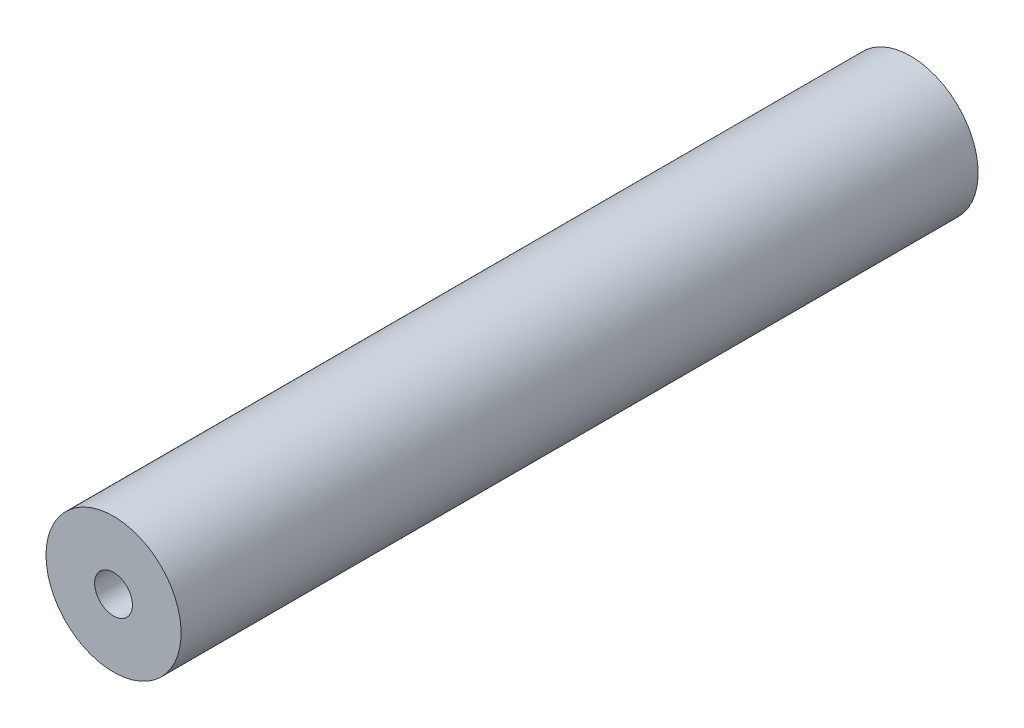
ISO-10303-21;
HEADER;
FILE_DESCRIPTION(('STEP AP214'),'2;1');
FILE_NAME('part.step','',(''),(''),'','','');
FILE_SCHEMA(('AUTOMOTIVE_DESIGN { 1 0 10303 214 1 1 1 1 }'));
ENDSEC;
DATA;
#1=APPLICATION_CONTEXT('core data for automotive mechanical design processes');
#2=APPLICATION_PROTOCOL_DEFINITION('international standard','automotive_design',2000,#1);
#3=PRODUCT_CONTEXT('',#1,'mechanical');
#4=PRODUCT('Part','Part','',(#3));
#5=PRODUCT_RELATED_PRODUCT_CATEGORY('part','',(#4));
#6=PRODUCT_DEFINITION_FORMATION('','',#4);
#7=PRODUCT_DEFINITION_CONTEXT('part definition',#1,'design');
#8=PRODUCT_DEFINITION('design','',#6,#7);
#9=PRODUCT_DEFINITION_SHAPE('','',#8);
#10=(LENGTH_UNIT() NAMED_UNIT(*) SI_UNIT(.MILLI.,.METRE.));
#11=(NAMED_UNIT(*) PLANE_ANGLE_UNIT() SI_UNIT($,.RADIAN.));
#12=(NAMED_UNIT(*) SI_UNIT($,.STERADIAN.) SOLID_ANGLE_UNIT());
#13=UNCERTAINTY_MEASURE_WITH_UNIT(LENGTH_MEASURE(1.E-05),#10,'distance_accuracy_value','');
#14=(GEOMETRIC_REPRESENTATION_CONTEXT(3) GLOBAL_UNCERTAINTY_ASSIGNED_CONTEXT((#13)) GLOBAL_UNIT_ASSIGNED_CONTEXT((#10,
#11,#12)) REPRESENTATION_CONTEXT('',''));
#15=CARTESIAN_POINT('',(0.,0.,0.));
#16=DIRECTION('',(0.,0.,1.));
#17=DIRECTION('',(1.,0.,0.));
#18=AXIS2_PLACEMENT_3D('',#15,#16,#17);
#19=CARTESIAN_POINT('',(0.,0.,374.65));
#20=DIRECTION('',(0.,0.,-1.));
#21=DIRECTION('',(-1.,0.,0.));
#22=AXIS2_PLACEMENT_3D('',#19,#20,#21);
#23=CYLINDRICAL_SURFACE('',#22,31.75);
#24=CARTESIAN_POINT('',(0.,0.,374.65));
#25=DIRECTION('',(0.,0.,1.));
#26=DIRECTION('',(1.,0.,0.));
#27=AXIS2_PLACEMENT_3D('',#24,#25,#26);
#28=CIRCLE('',#27,31.75);
#29=CARTESIAN_POINT('',(-31.75,0.,374.65));
#30=VERTEX_POINT('',#29);
#31=EDGE_CURVE('E10',#30,#30,#28,.T.);
#32=CARTESIAN_POINT('',(0.,0.,0.));
#33=DIRECTION('',(0.,0.,1.));
#34=DIRECTION('',(1.,0.,0.));
#35=AXIS2_PLACEMENT_3D('',#32,#33,#34);
#36=CIRCLE('',#35,31.75);
#37=CARTESIAN_POINT('',(-31.75,0.,0.));
#38=VERTEX_POINT('',#37);
#39=EDGE_CURVE('E38',#38,#38,#36,.T.);
#40=CARTESIAN_POINT('',(-31.75,0.,374.65));
#41=CARTESIAN_POINT('',(-31.75,0.,370.747395833333));
#42=CARTESIAN_POINT('',(-31.75,0.,366.844791666667));
#43=CARTESIAN_POINT('',(-31.75,0.,359.039583333333));
#44=CARTESIAN_POINT('',(-31.75,0.,355.136979166667));
#45=CARTESIAN_POINT('',(-31.75,0.,347.331770833333));
#46=CARTESIAN_POINT('',(-31.75,0.,343.429166666667));
#47=CARTESIAN_POINT('',(-31.75,0.,335.623958333333));
#48=CARTESIAN_POINT('',(-31.75,0.,331.721354166667));
#49=CARTESIAN_POINT('',(-31.75,0.,323.916145833333));
#50=CARTESIAN_POINT('',(-31.75,0.,320.013541666667));
#51=CARTESIAN_POINT('',(-31.75,0.,312.208333333333));
#52=CARTESIAN_POINT('',(-31.75,0.,308.305729166667));
#53=CARTESIAN_POINT('',(-31.75,0.,300.500520833333));
#54=CARTESIAN_POINT('',(-31.75,0.,296.597916666667));
#55=CARTESIAN_POINT('',(-31.75,0.,288.792708333333));
#56=CARTESIAN_POINT('',(-31.75,0.,284.890104166667));
#57=CARTESIAN_POINT('',(-31.75,0.,277.084895833333));
#58=CARTESIAN_POINT('',(-31.75,0.,273.182291666667));
#59=CARTESIAN_POINT('',(-31.75,0.,265.377083333333));
#60=CARTESIAN_POINT('',(-31.75,0.,261.474479166667));
#61=CARTESIAN_POINT('',(-31.75,0.,253.669270833333));
#62=CARTESIAN_POINT('',(-31.75,0.,249.766666666667));
#63=CARTESIAN_POINT('',(-31.75,0.,241.961458333333));
#64=CARTESIAN_POINT('',(-31.75,0.,238.058854166667));
#65=CARTESIAN_POINT('',(-31.75,0.,230.253645833333));
#66=CARTESIAN_POINT('',(-31.75,0.,226.351041666667));
#67=CARTESIAN_POINT('',(-31.75,0.,218.545833333333));
#68=CARTESIAN_POINT('',(-31.75,0.,214.643229166667));
#69=CARTESIAN_POINT('',(-31.75,0.,206.838020833333));
#70=CARTESIAN_POINT('',(-31.75,0.,202.935416666667));
#71=CARTESIAN_POINT('',(-31.75,0.,195.130208333333));
#72=CARTESIAN_POINT('',(-31.75,0.,191.227604166667));
#73=CARTESIAN_POINT('',(-31.75,0.,183.422395833333));
#74=CARTESIAN_POINT('',(-31.75,0.,179.519791666667));
#75=CARTESIAN_POINT('',(-31.75,0.,171.714583333333));
#76=CARTESIAN_POINT('',(-31.75,0.,167.811979166667));
#77=CARTESIAN_POINT('',(-31.75,0.,160.006770833333));
#78=CARTESIAN_POINT('',(-31.75,0.,156.104166666667));
#79=CARTESIAN_POINT('',(-31.75,0.,148.298958333333));
#80=CARTESIAN_POINT('',(-31.75,0.,144.396354166667));
#81=CARTESIAN_POINT('',(-31.75,0.,136.591145833333));
#82=CARTESIAN_POINT('',(-31.75,0.,132.688541666667));
#83=CARTESIAN_POINT('',(-31.75,0.,124.883333333333));
#84=CARTESIAN_POINT('',(-31.75,0.,120.980729166667));
#85=CARTESIAN_POINT('',(-31.75,0.,113.175520833333));
#86=CARTESIAN_POINT('',(-31.75,0.,109.272916666667));
#87=CARTESIAN_POINT('',(-31.75,0.,101.467708333333));
#88=CARTESIAN_POINT('',(-31.75,0.,97.5651041666667));
#89=CARTESIAN_POINT('',(-31.75,0.,89.7598958333333));
#90=CARTESIAN_POINT('',(-31.75,0.,85.8572916666667));
#91=CARTESIAN_POINT('',(-31.75,0.,78.0520833333333));
#92=CARTESIAN_POINT('',(-31.75,0.,74.1494791666667));
#93=CARTESIAN_POINT('',(-31.75,0.,66.3442708333333));
#94=CARTESIAN_POINT('',(-31.75,0.,62.4416666666667));
#95=CARTESIAN_POINT('',(-31.75,0.,54.6364583333333));
#96=CARTESIAN_POINT('',(-31.75,0.,50.7338541666667));
#97=CARTESIAN_POINT('',(-31.75,0.,42.9286458333333));
#98=CARTESIAN_POINT('',(-31.75,0.,39.0260416666667));
#99=CARTESIAN_POINT('',(-31.75,0.,31.2208333333333));
#100=CARTESIAN_POINT('',(-31.75,0.,27.3182291666667));
#101=CARTESIAN_POINT('',(-31.75,0.,19.5130208333333));
#102=CARTESIAN_POINT('',(-31.75,0.,15.6104166666667));
#103=CARTESIAN_POINT('',(-31.75,0.,7.80520833333335));
#104=CARTESIAN_POINT('',(-31.75,0.,3.90260416666668));
#105=CARTESIAN_POINT('',(-31.75,0.,0.));
#106=B_SPLINE_CURVE_WITH_KNOTS('',3,(#40,#41,#42,#43,#44,#45,#46,#47,#48,#49,#50,#51,#52,#53,
#54,#55,#56,#57,#58,#59,#60,#61,#62,#63,#64,#65,#66,#67,#68,#69,#70,#71,#72,#73,#74,#75,#76,#77,
#78,#79,#80,#81,#82,#83,#84,#85,#86,#87,#88,#89,#90,#91,#92,#93,#94,#95,#96,#97,#98,#99,#100,
#101,#102,#103,#104,#105),.UNSPECIFIED.,.F.,.F.,(4,2,2,2,2,2,2,2,2,2,2,2,2,2,2,2,2,2,2,2,2,2,2,
2,2,2,2,2,2,2,2,2,4),(0.,11.7078125,23.4156250000001,35.1234375,46.83125,58.5390625,70.246875,
81.9546875,93.6625,105.3703125,117.078125,128.7859375,140.49375,152.2015625,163.909375,
175.6171875,187.325,199.0328125,210.740625,222.4484375,234.15625,245.8640625,257.571875,
269.2796875,280.9875,292.6953125,304.403125,316.1109375,327.81875,339.5265625,351.234375,
362.9421875,374.65),.UNSPECIFIED.);
#107=EDGE_CURVE('BSEAM35',#30,#38,#106,.T.);
#108=ORIENTED_EDGE('',*,*,#31,.F.);
#109=ORIENTED_EDGE('',*,*,#39,.T.);
#110=ORIENTED_EDGE('',*,*,#107,.T.);
#111=ORIENTED_EDGE('',*,*,#107,.F.);
#112=EDGE_LOOP('',(#108,#110,#109,#111));
#113=FACE_BOUND('',#112,.T.);
#114=ADVANCED_FACE('F35',(#113),#23,.T.);
#115=CARTESIAN_POINT('',(0.,0.,374.65));
#116=DIRECTION('',(0.,0.,1.));
#117=DIRECTION('',(1.,0.,0.));
#118=AXIS2_PLACEMENT_3D('',#115,#116,#117);
#119=PLANE('',#118);
#120=CARTESIAN_POINT('',(0.,0.,374.65));
#121=DIRECTION('',(0.,0.,-1.));
#122=DIRECTION('',(-1.,0.,0.));
#123=AXIS2_PLACEMENT_3D('',#120,#121,#122);
#124=CIRCLE('',#123,8.89);
#125=CARTESIAN_POINT('',(-8.89,0.,374.65));
#126=VERTEX_POINT('',#125);
#127=EDGE_CURVE('E49',#126,#126,#124,.T.);
#128=ORIENTED_EDGE('',*,*,#127,.T.);
#129=EDGE_LOOP('',(#128));
#130=FACE_BOUND('',#129,.T.);
#131=ORIENTED_EDGE('',*,*,#31,.T.);
#132=EDGE_LOOP('',(#131));
#133=FACE_BOUND('',#132,.T.);
#134=ADVANCED_FACE('F57',(#130,#133),#119,.T.);
#135=CARTESIAN_POINT('',(0.,0.,0.));
#136=DIRECTION('',(0.,0.,1.));
#137=DIRECTION('',(1.,0.,0.));
#138=AXIS2_PLACEMENT_3D('',#135,#136,#137);
#139=PLANE('',#138);
#140=CARTESIAN_POINT('',(0.,0.,0.));
#141=DIRECTION('',(0.,0.,-1.));
#142=DIRECTION('',(-1.,0.,0.));
#143=AXIS2_PLACEMENT_3D('',#140,#141,#142);
#144=CIRCLE('',#143,8.89);
#145=CARTESIAN_POINT('',(-8.89,0.,0.));
#146=VERTEX_POINT('',#145);
#147=EDGE_CURVE('E51',#146,#146,#144,.T.);
#148=ORIENTED_EDGE('',*,*,#147,.F.);
#149=EDGE_LOOP('',(#148));
#150=FACE_BOUND('',#149,.T.);
#151=ORIENTED_EDGE('',*,*,#39,.F.);
#152=EDGE_LOOP('',(#151));
#153=FACE_BOUND('',#152,.T.);
#154=ADVANCED_FACE('F62',(#150,#153),#139,.F.);
#155=CARTESIAN_POINT('',(0.,0.,374.65));
#156=DIRECTION('',(0.,0.,-1.));
#157=DIRECTION('',(-1.,0.,0.));
#158=AXIS2_PLACEMENT_3D('',#155,#156,#157);
#159=CYLINDRICAL_SURFACE('',#158,8.89);
#160=CARTESIAN_POINT('',(-8.89,0.,374.65));
#161=CARTESIAN_POINT('',(-8.89,0.,370.747395833333));
#162=CARTESIAN_POINT('',(-8.89,0.,366.844791666667));
#163=CARTESIAN_POINT('',(-8.89,0.,359.039583333333));
#164=CARTESIAN_POINT('',(-8.89,0.,355.136979166667));
#165=CARTESIAN_POINT('',(-8.89,0.,347.331770833333));
#166=CARTESIAN_POINT('',(-8.89,0.,343.429166666667));
#167=CARTESIAN_POINT('',(-8.89,0.,335.623958333333));
#168=CARTESIAN_POINT('',(-8.89,0.,331.721354166667));
#169=CARTESIAN_POINT('',(-8.89,0.,323.916145833333));
#170=CARTESIAN_POINT('',(-8.89,0.,320.013541666667));
#171=CARTESIAN_POINT('',(-8.89,0.,312.208333333333));
#172=CARTESIAN_POINT('',(-8.89,0.,308.305729166667));
#173=CARTESIAN_POINT('',(-8.89,0.,300.500520833333));
#174=CARTESIAN_POINT('',(-8.89,0.,296.597916666667));
#175=CARTESIAN_POINT('',(-8.89,0.,288.792708333333));
#176=CARTESIAN_POINT('',(-8.89,0.,284.890104166667));
#177=CARTESIAN_POINT('',(-8.89,0.,277.084895833333));
#178=CARTESIAN_POINT('',(-8.89,0.,273.182291666667));
#179=CARTESIAN_POINT('',(-8.89,0.,265.377083333333));
#180=CARTESIAN_POINT('',(-8.89,0.,261.474479166667));
#181=CARTESIAN_POINT('',(-8.89,0.,253.669270833333));
#182=CARTESIAN_POINT('',(-8.89,0.,249.766666666667));
#183=CARTESIAN_POINT('',(-8.89,0.,241.961458333333));
#184=CARTESIAN_POINT('',(-8.89,0.,238.058854166667));
#185=CARTESIAN_POINT('',(-8.89,0.,230.253645833333));
#186=CARTESIAN_POINT('',(-8.89,0.,226.351041666667));
#187=CARTESIAN_POINT('',(-8.89,0.,218.545833333333));
#188=CARTESIAN_POINT('',(-8.89,0.,214.643229166667));
#189=CARTESIAN_POINT('',(-8.89,0.,206.838020833333));
#190=CARTESIAN_POINT('',(-8.89,0.,202.935416666667));
#191=CARTESIAN_POINT('',(-8.89,0.,195.130208333333));
#192=CARTESIAN_POINT('',(-8.89,0.,191.227604166667));
#193=CARTESIAN_POINT('',(-8.89,0.,183.422395833333));
#194=CARTESIAN_POINT('',(-8.89,0.,179.519791666667));
#195=CARTESIAN_POINT('',(-8.89,0.,171.714583333333));
#196=CARTESIAN_POINT('',(-8.89,0.,167.811979166667));
#197=CARTESIAN_POINT('',(-8.89,0.,160.006770833333));
#198=CARTESIAN_POINT('',(-8.89,0.,156.104166666667));
#199=CARTESIAN_POINT('',(-8.89,0.,148.298958333333));
#200=CARTESIAN_POINT('',(-8.89,0.,144.396354166667));
#201=CARTESIAN_POINT('',(-8.89,0.,136.591145833333));
#202=CARTESIAN_POINT('',(-8.89,0.,132.688541666667));
#203=CARTESIAN_POINT('',(-8.89,0.,124.883333333333));
#204=CARTESIAN_POINT('',(-8.89,0.,120.980729166667));
#205=CARTESIAN_POINT('',(-8.89,0.,113.175520833333));
#206=CARTESIAN_POINT('',(-8.89,0.,109.272916666667));
#207=CARTESIAN_POINT('',(-8.89,0.,101.467708333333));
#208=CARTESIAN_POINT('',(-8.89,0.,97.5651041666667));
#209=CARTESIAN_POINT('',(-8.89,0.,89.7598958333333));
#210=CARTESIAN_POINT('',(-8.89,0.,85.8572916666667));
#211=CARTESIAN_POINT('',(-8.89,0.,78.0520833333333));
#212=CARTESIAN_POINT('',(-8.89,0.,74.1494791666667));
#213=CARTESIAN_POINT('',(-8.89,0.,66.3442708333333));
#214=CARTESIAN_POINT('',(-8.89,0.,62.4416666666667));
#215=CARTESIAN_POINT('',(-8.89,0.,54.6364583333333));
#216=CARTESIAN_POINT('',(-8.89,0.,50.7338541666667));
#217=CARTESIAN_POINT('',(-8.89,0.,42.9286458333333));
#218=CARTESIAN_POINT('',(-8.89,0.,39.0260416666667));
#219=CARTESIAN_POINT('',(-8.89,0.,31.2208333333333));
#220=CARTESIAN_POINT('',(-8.89,0.,27.3182291666667));
#221=CARTESIAN_POINT('',(-8.89,0.,19.5130208333333));
#222=CARTESIAN_POINT('',(-8.89,0.,15.6104166666667));
#223=CARTESIAN_POINT('',(-8.89,0.,7.80520833333335));
#224=CARTESIAN_POINT('',(-8.89,0.,3.90260416666668));
#225=CARTESIAN_POINT('',(-8.89,0.,0.));
#226=B_SPLINE_CURVE_WITH_KNOTS('',3,(#160,#161,#162,#163,#164,#165,#166,#167,#168,#169,#170,
#171,#172,#173,#174,#175,#176,#177,#178,#179,#180,#181,#182,#183,#184,#185,#186,#187,#188,#189,
#190,#191,#192,#193,#194,#195,#196,#197,#198,#199,#200,#201,#202,#203,#204,#205,#206,#207,#208,
#209,#210,#211,#212,#213,#214,#215,#216,#217,#218,#219,#220,#221,#222,#223,#224,#225),
.UNSPECIFIED.,.F.,.F.,(4,2,2,2,2,2,2,2,2,2,2,2,2,2,2,2,2,2,2,2,2,2,2,2,2,2,2,2,2,2,2,2,4),(0.,
11.7078125,23.415625,35.1234375,46.83125,58.5390625,70.246875,81.9546875,93.6625,105.3703125,
117.078125,128.7859375,140.49375,152.2015625,163.909375,175.6171875,187.325,199.0328125,
210.740625,222.4484375,234.15625,245.8640625,257.571875,269.2796875,280.9875,292.6953125,
304.403125,316.1109375,327.81875,339.5265625,351.234375,362.9421875,374.65),.UNSPECIFIED.);
#227=EDGE_CURVE('BSEAM59',#126,#146,#226,.T.);
#228=ORIENTED_EDGE('',*,*,#127,.F.);
#229=ORIENTED_EDGE('',*,*,#147,.T.);
#230=ORIENTED_EDGE('',*,*,#227,.T.);
#231=ORIENTED_EDGE('',*,*,#227,.F.);
#232=EDGE_LOOP('',(#228,#230,#229,#231));
#233=FACE_BOUND('',#232,.T.);
#234=ADVANCED_FACE('F59',(#233),#159,.F.);
#235=CLOSED_SHELL('',(#114,#134,#154,#234));
#236=MANIFOLD_SOLID_BREP('B2',#235);
#237=ADVANCED_BREP_SHAPE_REPRESENTATION('',(#18,#236),#14);
#238=SHAPE_DEFINITION_REPRESENTATION(#9,#237);
ENDSEC;
END-ISO-10303-21;
